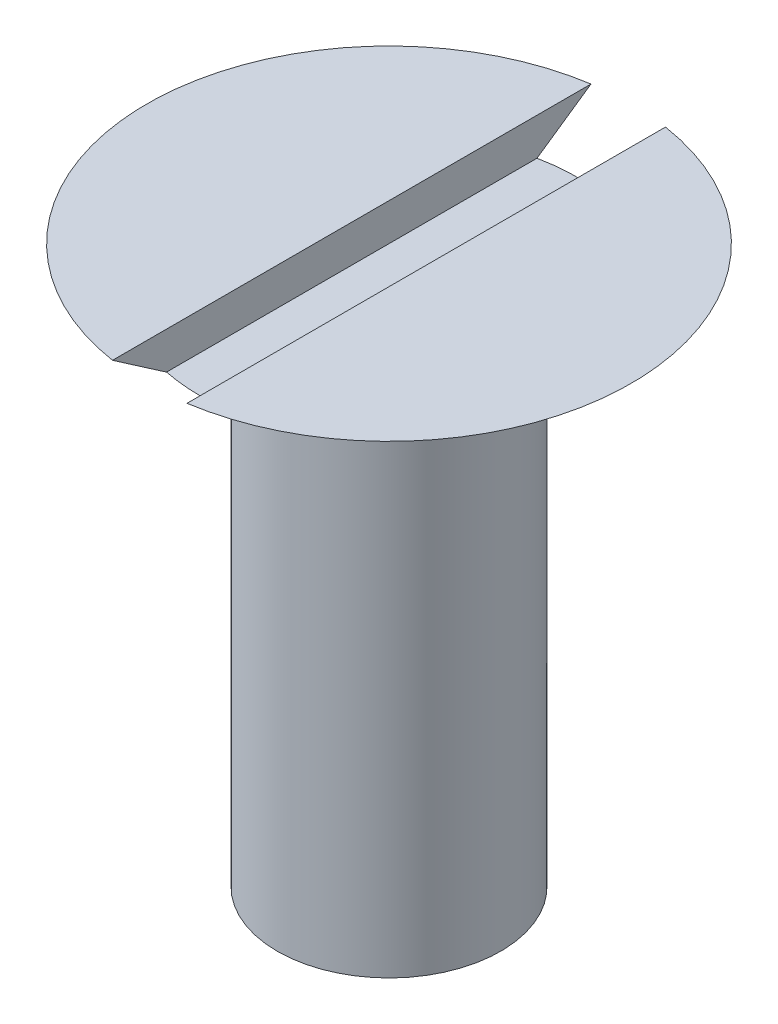
ISO-10303-21;
HEADER;
FILE_DESCRIPTION(('STEP AP214'),'2;1');
FILE_NAME('part.step','',(''),(''),'','','');
FILE_SCHEMA(('AUTOMOTIVE_DESIGN { 1 0 10303 214 1 1 1 1 }'));
ENDSEC;
DATA;
#1=APPLICATION_CONTEXT('core data for automotive mechanical design processes');
#2=APPLICATION_PROTOCOL_DEFINITION('international standard','automotive_design',2000,#1);
#3=PRODUCT_CONTEXT('',#1,'mechanical');
#4=PRODUCT('Part','Part','',(#3));
#5=PRODUCT_RELATED_PRODUCT_CATEGORY('part','',(#4));
#6=PRODUCT_DEFINITION_FORMATION('','',#4);
#7=PRODUCT_DEFINITION_CONTEXT('part definition',#1,'design');
#8=PRODUCT_DEFINITION('design','',#6,#7);
#9=PRODUCT_DEFINITION_SHAPE('','',#8);
#10=(LENGTH_UNIT() NAMED_UNIT(*) SI_UNIT(.MILLI.,.METRE.));
#11=(NAMED_UNIT(*) PLANE_ANGLE_UNIT() SI_UNIT($,.RADIAN.));
#12=(NAMED_UNIT(*) SI_UNIT($,.STERADIAN.) SOLID_ANGLE_UNIT());
#13=UNCERTAINTY_MEASURE_WITH_UNIT(LENGTH_MEASURE(1.E-05),#10,'distance_accuracy_value','');
#14=(GEOMETRIC_REPRESENTATION_CONTEXT(3) GLOBAL_UNCERTAINTY_ASSIGNED_CONTEXT((#13)) GLOBAL_UNIT_ASSIGNED_CONTEXT((#10,
#11,#12)) REPRESENTATION_CONTEXT('',''));
#15=CARTESIAN_POINT('',(0.,0.,0.));
#16=DIRECTION('',(0.,0.,1.));
#17=DIRECTION('',(1.,0.,0.));
#18=AXIS2_PLACEMENT_3D('',#15,#16,#17);
#19=CARTESIAN_POINT('',(0.,14.950726383734,0.));
#20=DIRECTION('',(0.,-1.,0.));
#21=DIRECTION('',(0.,0.,-1.));
#22=AXIS2_PLACEMENT_3D('',#19,#20,#21);
#23=PLANE('',#22);
#24=DIRECTION('',(0.,0.,1.));
#25=VECTOR('',#24,1.);
#26=CARTESIAN_POINT('',(1.00000000000003,14.950726383734,-6.50000000000001));
#27=LINE('',#26,#25);
#28=CARTESIAN_POINT('',(0.999999999999999,14.950726383734,-6.42261628933256));
#29=VERTEX_POINT('',#28);
#30=CARTESIAN_POINT('',(1.,14.950726383734,6.42261628933256));
#31=VERTEX_POINT('',#30);
#32=EDGE_CURVE('E138',#29,#31,#27,.T.);
#33=ORIENTED_EDGE('',*,*,#32,.T.);
#34=CARTESIAN_POINT('',(0.,14.950726383734,0.));
#35=DIRECTION('',(0.,1.,0.));
#36=DIRECTION('',(0.,0.,1.));
#37=AXIS2_PLACEMENT_3D('',#34,#35,#36);
#38=CIRCLE('',#37,6.5);
#39=EDGE_CURVE('E133',#31,#29,#38,.T.);
#40=ORIENTED_EDGE('',*,*,#39,.T.);
#41=EDGE_LOOP('',(#33,#40));
#42=FACE_BOUND('',#41,.T.);
#43=ADVANCED_FACE('F42',(#42),#23,.F.);
#44=CARTESIAN_POINT('',(0.,12.5,0.));
#45=DIRECTION('',(0.,1.,0.));
#46=DIRECTION('',(0.,0.,1.));
#47=AXIS2_PLACEMENT_3D('',#44,#45,#46);
#48=CONICAL_SURFACE('',#47,3.,0.95993108859688);
#49=CARTESIAN_POINT('',(0.,12.5,0.));
#50=DIRECTION('',(0.,1.,0.));
#51=DIRECTION('',(0.,0.,1.));
#52=AXIS2_PLACEMENT_3D('',#49,#50,#51);
#53=CIRCLE('',#52,3.);
#54=CARTESIAN_POINT('',(0.,12.5,3.));
#55=VERTEX_POINT('',#54);
#56=EDGE_CURVE('E127',#55,#55,#53,.T.);
#57=ORIENTED_EDGE('',*,*,#56,.T.);
#58=EDGE_LOOP('',(#57));
#59=FACE_BOUND('',#58,.T.);
#60=CARTESIAN_POINT('',(1.00000000000001,14.951426383734,-6.42362803610768));
#61=CARTESIAN_POINT('',(1.00000000000001,14.7965139900653,-6.19970336377959));
#62=CARTESIAN_POINT('',(1.00000000000001,14.6417117196829,-5.9757021324474));
#63=CARTESIAN_POINT('',(1.00000000000001,14.3324566281598,-5.52742720787741));
#64=CARTESIAN_POINT('',(1.00000000000001,14.1780038416323,-5.30315349076613));
#65=CARTESIAN_POINT('',(1.00000000000001,13.8717187304788,-4.85733140976845));
#66=CARTESIAN_POINT('',(1.00000000000002,13.719879492516,-4.63578779769756));
#67=CARTESIAN_POINT('',(1.00000000000001,13.4169561463886,-4.19221258476304));
#68=CARTESIAN_POINT('',(0.999999999999998,13.2658719732557,-3.97018102833574));
#69=CARTESIAN_POINT('',(1.,13.0256088981052,-3.61503960384481));
#70=CARTESIAN_POINT('',(1.00000000000001,12.9360440611501,-3.48219100247491));
#71=CARTESIAN_POINT('',(1.00000000000001,12.7574892327623,-3.21606590039512));
#72=CARTESIAN_POINT('',(1.00000000000001,12.6684993703745,-3.08278931303491));
#73=CARTESIAN_POINT('',(1.00000000000001,12.4904948171189,-2.81435971697741));
#74=CARTESIAN_POINT('',(1.00000000000001,12.4014884927007,-2.67920114640122));
#75=CARTESIAN_POINT('',(1.00000000000001,12.2248447325522,-2.40813276916209));
#76=CARTESIAN_POINT('',(1.,12.1372063404108,-2.27222358641676));
#77=CARTESIAN_POINT('',(1.,11.9632771262562,-1.99797492339448));
#78=CARTESIAN_POINT('',(1.00000000000001,11.877003143124,-1.85962466093085));
#79=CARTESIAN_POINT('',(1.00000000000001,11.7502486949999,-1.65020971976964));
#80=CARTESIAN_POINT('',(1.00000000000001,11.7083812402023,-1.57998669087204));
#81=CARTESIAN_POINT('',(1.00000000000001,11.6259520701719,-1.43878044178623));
#82=CARTESIAN_POINT('',(1.00000000000001,11.5853902747576,-1.36779726863722));
#83=CARTESIAN_POINT('',(1.00000000000001,11.5066359618916,-1.22574930082218));
#84=CARTESIAN_POINT('',(1.00000000000001,11.4684191766972,-1.15469804346936));
#85=CARTESIAN_POINT('',(1.00000000000001,11.3945862347029,-1.01118073316757));
#86=CARTESIAN_POINT('',(1.00000000000001,11.3589717957904,-0.93871378496773));
#87=CARTESIAN_POINT('',(1.00000000000001,11.2918829035429,-0.792300429653788));
#88=CARTESIAN_POINT('',(1.00000000000002,11.2603886650806,-0.718363217275427));
#89=CARTESIAN_POINT('',(1.00000000000001,11.2035156525853,-0.568207637076927));
#90=CARTESIAN_POINT('',(0.999999999999998,11.1781268702176,-0.491993235953346));
#91=CARTESIAN_POINT('',(1.,11.144977521099,-0.368333445342041));
#92=CARTESIAN_POINT('',(1.00000000000001,11.1342382474767,-0.321696091773746));
#93=CARTESIAN_POINT('',(1.00000000000001,11.1167992401518,-0.227654188564721));
#94=CARTESIAN_POINT('',(1.00000000000001,11.1100992450155,-0.180249688779877));
#95=CARTESIAN_POINT('',(1.00000000000001,11.1013662451796,-0.0853600362730016));
#96=CARTESIAN_POINT('',(1.00000000000001,11.099298569529,-0.0378781628267392));
#97=CARTESIAN_POINT('',(1.00000000000001,11.0999356784908,0.0570589969793447));
#98=CARTESIAN_POINT('',(1.00000000000001,11.1026410796064,0.104514279112602));
#99=CARTESIAN_POINT('',(1.00000000000001,11.1125233041378,0.198622801513355));
#100=CARTESIAN_POINT('',(1.00000000000001,11.1196701937526,0.245279279756146));
#101=CARTESIAN_POINT('',(1.00000000000001,11.1378059500239,0.337827899755186));
#102=CARTESIAN_POINT('',(1.00000000000001,11.1487953507261,0.383719934337044));
#103=CARTESIAN_POINT('',(1.00000000000001,11.1740192587125,0.475066336073127));
#104=CARTESIAN_POINT('',(1.00000000000001,11.1882841947041,0.520512146367663));
#105=CARTESIAN_POINT('',(1.00000000000001,11.2193099378505,0.610524912360574));
#106=CARTESIAN_POINT('',(1.00000000000001,11.2360704446865,0.655091973078515));
#107=CARTESIAN_POINT('',(1.00000000000001,11.2741746601509,0.75005730567476));
#108=CARTESIAN_POINT('',(1.00000000000001,11.2958288786199,0.800329913567384));
#109=CARTESIAN_POINT('',(1.00000000000001,11.3410437394786,0.900014990400857));
#110=CARTESIAN_POINT('',(1.00000000000001,11.3646048309023,0.949427253397873));
#111=CARTESIAN_POINT('',(1.00000000000001,11.437449726808,1.09669695720563));
#112=CARTESIAN_POINT('',(1.00000000000001,11.4888575470089,1.19349879835829));
#113=CARTESIAN_POINT('',(1.00000000000001,11.5951122151018,1.38550284234813));
#114=CARTESIAN_POINT('',(1.00000000000001,11.6499680813646,1.48069994798157));
#115=CARTESIAN_POINT('',(1.00000000000001,11.7617907597581,1.66985666742106));
#116=CARTESIAN_POINT('',(1.00000000000001,11.8187578132606,1.76381613805354));
#117=CARTESIAN_POINT('',(1.00000000000001,11.934301190611,1.95122236593946));
#118=CARTESIAN_POINT('',(1.00000000000001,11.9928827495414,2.04466587775217));
#119=CARTESIAN_POINT('',(1.00000000000001,12.1110315687426,2.23094242169524));
#120=CARTESIAN_POINT('',(1.00000000000001,12.1705989493502,2.3237753773348));
#121=CARTESIAN_POINT('',(1.00000000000001,12.3501144609208,2.6012554483497));
#122=CARTESIAN_POINT('',(1.,12.4710949689759,2.78523363550447));
#123=CARTESIAN_POINT('',(1.,12.689976184362,3.11506207670188));
#124=CARTESIAN_POINT('',(1.00000000000001,12.7875968913187,3.26109922412603));
#125=CARTESIAN_POINT('',(1.00000000000001,12.9835231715857,3.55271662820756));
#126=CARTESIAN_POINT('',(1.00000000000001,13.0818287549391,3.69829687811925));
#127=CARTESIAN_POINT('',(1.00000000000001,13.377591716564,4.13476065082375));
#128=CARTESIAN_POINT('',(1.00000000000001,13.5757587133282,4.42516277507503));
#129=CARTESIAN_POINT('',(1.00000000000001,13.9699105181373,5.00058090661142));
#130=CARTESIAN_POINT('',(1.00000000000001,14.1658789110031,5.28560818361849));
#131=CARTESIAN_POINT('',(1.00000000000001,14.5583220700331,5.85500225912971));
#132=CARTESIAN_POINT('',(1.00000000000001,14.7547963526673,6.1393693907557));
#133=CARTESIAN_POINT('',(1.,14.951426383734,6.42362803610774));
#134=B_SPLINE_CURVE_WITH_KNOTS('',3,(#60,#61,#62,#63,#64,#65,#66,#67,#68,#69,#70,#71,#72,#73,
#74,#75,#76,#77,#78,#79,#80,#81,#82,#83,#84,#85,#86,#87,#88,#89,#90,#91,#92,#93,#94,#95,#96,#97,
#98,#99,#100,#101,#102,#103,#104,#105,#106,#107,#108,#109,#110,#111,#112,#113,#114,#115,#116,
#117,#118,#119,#120,#121,#122,#123,#124,#125,#126,#127,#128,#129,#130,#131,#132,#133),
.UNSPECIFIED.,.F.,.F.,(4,2,2,2,2,2,2,2,2,2,2,2,2,2,2,2,2,2,2,2,2,2,2,2,2,2,2,2,2,2,2,2,2,2,2,2,
4),(0.,0.816860890652607,1.63379942297092,2.43954703921576,3.24522408965545,3.7258844607954,
4.20664920256384,4.69214307216297,5.177280746304,5.66637841059722,5.91163900247177,
6.15688450385516,6.39888127155619,6.64103637183978,6.88198226060266,7.12253044590371,
7.26596093299882,7.40938213586174,7.55172625387177,7.69408875876821,7.83550205146783,
7.97693500610371,8.11973916845119,8.26252615951118,8.4266854062523,8.5908834226307,
8.9195674492254,9.24915013229193,9.57877061348077,9.90962756687595,10.240525209457,
10.9010823668273,11.4280629227337,11.9550512227702,13.0097653760744,14.0474531197022,
15.0843710188812),.UNSPECIFIED.);
#135=CARTESIAN_POINT('',(1.,13.950726383734,-4.97229148798759));
#136=VERTEX_POINT('',#135);
#137=EDGE_CURVE('E11',#29,#136,#134,.T.);
#138=ORIENTED_EDGE('',*,*,#137,.F.);
#139=ORIENTED_EDGE('',*,*,#39,.F.);
#140=CARTESIAN_POINT('',(1.00000000000003,13.950726383734,4.97229148798763));
#141=VERTEX_POINT('',#140);
#142=EDGE_CURVE('E46',#141,#31,#134,.T.);
#143=ORIENTED_EDGE('',*,*,#142,.F.);
#144=CARTESIAN_POINT('',(0.,13.950726383734,0.));
#145=DIRECTION('',(0.,1.,0.));
#146=DIRECTION('',(0.,0.,1.));
#147=AXIS2_PLACEMENT_3D('',#144,#145,#146);
#148=CIRCLE('',#147,5.07185199325788);
#149=CARTESIAN_POINT('',(-0.999999999999984,13.950726383734,4.97229148798763));
#150=VERTEX_POINT('',#149);
#151=EDGE_CURVE('E102',#150,#141,#148,.T.);
#152=ORIENTED_EDGE('',*,*,#151,.F.);
#153=CARTESIAN_POINT('',(-0.999999999999973,14.951426383734,-6.42362803610769));
#154=CARTESIAN_POINT('',(-1.00000000000002,14.7965139900653,-6.1997033637796));
#155=CARTESIAN_POINT('',(-1.00000000000003,14.6417117196829,-5.9757021324474));
#156=CARTESIAN_POINT('',(-1.00000000000004,14.3324566281598,-5.52742720787742));
#157=CARTESIAN_POINT('',(-1.00000000000003,14.1780038416323,-5.30315349076614));
#158=CARTESIAN_POINT('',(-1.00000000000004,13.8717187304788,-4.85733140976846));
#159=CARTESIAN_POINT('',(-1.00000000000005,13.719879492516,-4.63578779769757));
#160=CARTESIAN_POINT('',(-1.00000000000002,13.4169561463886,-4.19221258476305));
#161=CARTESIAN_POINT('',(-0.999999999999987,13.2658719732557,-3.97018102833575));
#162=CARTESIAN_POINT('',(-1.,13.0256088981052,-3.61503960384482));
#163=CARTESIAN_POINT('',(-1.00000000000003,12.9360440611501,-3.48219100247492));
#164=CARTESIAN_POINT('',(-1.00000000000004,12.7574892327623,-3.21606590039513));
#165=CARTESIAN_POINT('',(-1.00000000000004,12.6684993703745,-3.08278931303493));
#166=CARTESIAN_POINT('',(-1.00000000000003,12.4904948171189,-2.81435971697743));
#167=CARTESIAN_POINT('',(-1.00000000000003,12.4014884927007,-2.67920114640123));
#168=CARTESIAN_POINT('',(-1.00000000000004,12.2248447325522,-2.40813276916212));
#169=CARTESIAN_POINT('',(-1.00000000000004,12.1372063404108,-2.27222358641681));
#170=CARTESIAN_POINT('',(-1.00000000000004,11.9632771262562,-1.99797492339452));
#171=CARTESIAN_POINT('',(-1.00000000000004,11.877003143124,-1.85962466093087));
#172=CARTESIAN_POINT('',(-1.00000000000003,11.7502486949999,-1.65020971976965));
#173=CARTESIAN_POINT('',(-1.00000000000003,11.7083812402023,-1.57998669087205));
#174=CARTESIAN_POINT('',(-1.00000000000003,11.6259520701719,-1.43878044178624));
#175=CARTESIAN_POINT('',(-1.00000000000003,11.5853902747576,-1.36779726863723));
#176=CARTESIAN_POINT('',(-1.00000000000003,11.5066359618916,-1.22574930082218));
#177=CARTESIAN_POINT('',(-1.00000000000004,11.4684191766972,-1.15469804346937));
#178=CARTESIAN_POINT('',(-1.00000000000003,11.3945862347029,-1.01118073316757));
#179=CARTESIAN_POINT('',(-1.00000000000003,11.3589717957904,-0.938713784967726));
#180=CARTESIAN_POINT('',(-1.00000000000004,11.2918829035429,-0.792300429653779));
#181=CARTESIAN_POINT('',(-1.00000000000005,11.2603886650806,-0.718363217275414));
#182=CARTESIAN_POINT('',(-1.00000000000002,11.2035156525853,-0.568207637076913));
#183=CARTESIAN_POINT('',(-0.999999999999991,11.1781268702176,-0.491993235953334));
#184=CARTESIAN_POINT('',(-1.00000000000001,11.144977521099,-0.368333445342026));
#185=CARTESIAN_POINT('',(-1.00000000000003,11.1342382474767,-0.321696091773728));
#186=CARTESIAN_POINT('',(-1.00000000000004,11.1167992401518,-0.2276541885647));
#187=CARTESIAN_POINT('',(-1.00000000000003,11.1100992450155,-0.180249688779855));
#188=CARTESIAN_POINT('',(-1.00000000000004,11.1013662451797,-0.0853600362729776));
#189=CARTESIAN_POINT('',(-1.00000000000005,11.0992985695291,-0.0378781628267143));
#190=CARTESIAN_POINT('',(-1.00000000000002,11.0999356784909,0.0570589969793718));
#191=CARTESIAN_POINT('',(-0.999999999999976,11.1026410796064,0.10451427911263));
#192=CARTESIAN_POINT('',(-0.999999999999977,11.1125233041378,0.198622801513378));
#193=CARTESIAN_POINT('',(-1.00000000000002,11.1196701937526,0.245279279756164));
#194=CARTESIAN_POINT('',(-1.00000000000005,11.1378059500239,0.337827899755196));
#195=CARTESIAN_POINT('',(-1.00000000000004,11.1487953507261,0.383719934337051));
#196=CARTESIAN_POINT('',(-1.00000000000003,11.1740192587125,0.475066336073128));
#197=CARTESIAN_POINT('',(-1.00000000000004,11.1882841947041,0.52051214636766));
#198=CARTESIAN_POINT('',(-1.00000000000003,11.2193099378506,0.610524912360565));
#199=CARTESIAN_POINT('',(-1.,11.2360704446865,0.655091973078505));
#200=CARTESIAN_POINT('',(-0.999999999999998,11.2741746601509,0.750057305674746));
#201=CARTESIAN_POINT('',(-1.00000000000002,11.2958288786199,0.800329913567368));
#202=CARTESIAN_POINT('',(-1.00000000000004,11.3410437394786,0.900014990400839));
#203=CARTESIAN_POINT('',(-1.00000000000004,11.3646048309023,0.949427253397857));
#204=CARTESIAN_POINT('',(-1.00000000000003,11.437449726808,1.09669695720562));
#205=CARTESIAN_POINT('',(-1.00000000000003,11.4888575470089,1.19349879835828));
#206=CARTESIAN_POINT('',(-1.00000000000004,11.5951122151018,1.38550284234812));
#207=CARTESIAN_POINT('',(-1.00000000000004,11.6499680813646,1.48069994798156));
#208=CARTESIAN_POINT('',(-1.00000000000003,11.7617907597581,1.66985666742106));
#209=CARTESIAN_POINT('',(-1.00000000000003,11.8187578132606,1.76381613805354));
#210=CARTESIAN_POINT('',(-1.00000000000003,11.934301190611,1.95122236593946));
#211=CARTESIAN_POINT('',(-1.00000000000003,11.9928827495414,2.04466587775218));
#212=CARTESIAN_POINT('',(-1.00000000000004,12.1110315687426,2.23094242169525));
#213=CARTESIAN_POINT('',(-1.00000000000004,12.1705989493502,2.32377537733481));
#214=CARTESIAN_POINT('',(-1.00000000000003,12.3501144609208,2.60125544834972));
#215=CARTESIAN_POINT('',(-1.00000000000001,12.4710949689759,2.7852336355045));
#216=CARTESIAN_POINT('',(-1.00000000000002,12.689976184362,3.1150620767019));
#217=CARTESIAN_POINT('',(-1.00000000000003,12.7875968913187,3.26109922412605));
#218=CARTESIAN_POINT('',(-1.00000000000004,12.9835231715857,3.55271662820756));
#219=CARTESIAN_POINT('',(-1.00000000000004,13.0818287549391,3.69829687811925));
#220=CARTESIAN_POINT('',(-1.00000000000003,13.377591716564,4.13476065082375));
#221=CARTESIAN_POINT('',(-1.00000000000003,13.5757587133282,4.42516277507502));
#222=CARTESIAN_POINT('',(-1.00000000000004,13.9699105181373,5.00058090661139));
#223=CARTESIAN_POINT('',(-1.00000000000004,14.165878911003,5.28560818361847));
#224=CARTESIAN_POINT('',(-1.00000000000003,14.5583220700331,5.85500225912967));
#225=CARTESIAN_POINT('',(-1.00000000000003,14.7547963526673,6.13936939075566));
#226=CARTESIAN_POINT('',(-1.00000000000001,14.951426383734,6.42362803610768));
#227=B_SPLINE_CURVE_WITH_KNOTS('',3,(#153,#154,#155,#156,#157,#158,#159,#160,#161,#162,#163,
#164,#165,#166,#167,#168,#169,#170,#171,#172,#173,#174,#175,#176,#177,#178,#179,#180,#181,#182,
#183,#184,#185,#186,#187,#188,#189,#190,#191,#192,#193,#194,#195,#196,#197,#198,#199,#200,#201,
#202,#203,#204,#205,#206,#207,#208,#209,#210,#211,#212,#213,#214,#215,#216,#217,#218,#219,#220,
#221,#222,#223,#224,#225,#226),.UNSPECIFIED.,.F.,.F.,(4,2,2,2,2,2,2,2,2,2,2,2,2,2,2,2,2,2,2,2,2,
2,2,2,2,2,2,2,2,2,2,2,2,2,2,2,4),(0.,0.816860890652607,1.63379942297092,2.43954703921576,
3.24522408965545,3.7258844607954,4.20664920256383,4.69214307216295,5.17728074630397,
5.66637841059721,5.91163900247176,6.15688450385516,6.39888127155619,6.64103637183979,
6.88198226060269,7.12253044590374,7.26596093299884,7.40938213586177,7.5517262538718,
7.69408875876825,7.83550205146785,7.97693500610372,8.11973916845118,8.26252615951117,
8.42668540625228,8.59088342263069,8.9195674492254,9.24915013229193,9.57877061348077,
9.90962756687597,10.240525209457,10.9010823668273,11.4280629227337,11.9550512227702,
13.0097653760744,14.0474531197021,15.0843710188812),.UNSPECIFIED.);
#228=CARTESIAN_POINT('',(-0.999999999999987,14.950726383734,6.42261628933263));
#229=VERTEX_POINT('',#228);
#230=EDGE_CURVE('E104',#150,#229,#227,.T.);
#231=ORIENTED_EDGE('',*,*,#230,.T.);
#232=CARTESIAN_POINT('',(-1.,14.950726383734,-6.42261628933256));
#233=VERTEX_POINT('',#232);
#234=EDGE_CURVE('E110',#233,#229,#38,.T.);
#235=ORIENTED_EDGE('',*,*,#234,.F.);
#236=CARTESIAN_POINT('',(-1.,13.950726383734,-4.97229148798758));
#237=VERTEX_POINT('',#236);
#238=EDGE_CURVE('E101',#233,#237,#227,.T.);
#239=ORIENTED_EDGE('',*,*,#238,.T.);
#240=EDGE_CURVE('E58',#136,#237,#148,.T.);
#241=ORIENTED_EDGE('',*,*,#240,.F.);
#242=EDGE_LOOP('',(#138,#139,#143,#152,#231,#235,#239,#241));
#243=FACE_BOUND('',#242,.T.);
#244=ADVANCED_FACE('F108',(#59,#243),#48,.T.);
#245=ORIENTED_EDGE('',*,*,#234,.T.);
#246=DIRECTION('',(0.,0.,1.));
#247=VECTOR('',#246,1.);
#248=CARTESIAN_POINT('',(-1.00000000000003,14.950726383734,-6.50000000000004));
#249=LINE('',#248,#247);
#250=EDGE_CURVE('E65',#233,#229,#249,.T.);
#251=ORIENTED_EDGE('',*,*,#250,.F.);
#252=EDGE_LOOP('',(#245,#251));
#253=FACE_BOUND('',#252,.T.);
#254=ADVANCED_FACE('F44',(#253),#23,.F.);
#255=CARTESIAN_POINT('',(0.,0.,0.));
#256=DIRECTION('',(0.,1.,0.));
#257=DIRECTION('',(0.,0.,1.));
#258=AXIS2_PLACEMENT_3D('',#255,#256,#257);
#259=CONICAL_SURFACE('',#258,3.,1.04719755119659);
#260=CARTESIAN_POINT('',(0.,-1.73205080756889,0.));
#261=VERTEX_POINT('',#260);
#262=VERTEX_LOOP('',#261);
#263=FACE_BOUND('',#262,.T.);
#264=CARTESIAN_POINT('',(0.,0.,0.));
#265=DIRECTION('',(0.,1.,0.));
#266=DIRECTION('',(0.,0.,1.));
#267=AXIS2_PLACEMENT_3D('',#264,#265,#266);
#268=CIRCLE('',#267,3.);
#269=CARTESIAN_POINT('',(0.,0.,3.));
#270=VERTEX_POINT('',#269);
#271=EDGE_CURVE('E122',#270,#270,#268,.T.);
#272=ORIENTED_EDGE('',*,*,#271,.F.);
#273=EDGE_LOOP('',(#272));
#274=FACE_BOUND('',#273,.T.);
#275=ADVANCED_FACE('F163',(#263,#274),#259,.T.);
#276=CARTESIAN_POINT('',(0.,14.950726383734,0.));
#277=DIRECTION('',(0.,1.,0.));
#278=DIRECTION('',(0.,0.,1.));
#279=AXIS2_PLACEMENT_3D('',#276,#277,#278);
#280=CYLINDRICAL_SURFACE('',#279,3.);
#281=ORIENTED_EDGE('',*,*,#56,.F.);
#282=EDGE_LOOP('',(#281));
#283=FACE_BOUND('',#282,.T.);
#284=ORIENTED_EDGE('',*,*,#271,.T.);
#285=EDGE_LOOP('',(#284));
#286=FACE_BOUND('',#285,.T.);
#287=ADVANCED_FACE('F157',(#283,#286),#280,.T.);
#288=CARTESIAN_POINT('',(1.00000000000001,0.,-6.49999999999997));
#289=DIRECTION('',(-1.,0.,0.));
#290=DIRECTION('',(0.,-1.,0.));
#291=AXIS2_PLACEMENT_3D('',#288,#289,#290);
#292=PLANE('',#291);
#293=ORIENTED_EDGE('',*,*,#137,.T.);
#294=DIRECTION('',(0.,0.,1.));
#295=VECTOR('',#294,1.);
#296=CARTESIAN_POINT('',(1.00000000000003,13.950726383734,-6.50000000000001));
#297=LINE('',#296,#295);
#298=EDGE_CURVE('E96',#136,#141,#297,.T.);
#299=ORIENTED_EDGE('',*,*,#298,.T.);
#300=ORIENTED_EDGE('',*,*,#142,.T.);
#301=ORIENTED_EDGE('',*,*,#32,.F.);
#302=EDGE_LOOP('',(#293,#299,#300,#301));
#303=FACE_BOUND('',#302,.T.);
#304=ADVANCED_FACE('F155',(#303),#292,.T.);
#305=CARTESIAN_POINT('',(0.,13.950726383734,-6.50000000000001));
#306=DIRECTION('',(0.,1.,0.));
#307=DIRECTION('',(0.,0.,1.));
#308=AXIS2_PLACEMENT_3D('',#305,#306,#307);
#309=PLANE('',#308);
#310=ORIENTED_EDGE('',*,*,#240,.T.);
#311=DIRECTION('',(0.,0.,1.));
#312=VECTOR('',#311,1.);
#313=CARTESIAN_POINT('',(-1.00000000000003,13.950726383734,-6.50000000000004));
#314=LINE('',#313,#312);
#315=EDGE_CURVE('E93',#237,#150,#314,.T.);
#316=ORIENTED_EDGE('',*,*,#315,.T.);
#317=ORIENTED_EDGE('',*,*,#151,.T.);
#318=ORIENTED_EDGE('',*,*,#298,.F.);
#319=EDGE_LOOP('',(#310,#316,#317,#318));
#320=FACE_BOUND('',#319,.T.);
#321=ADVANCED_FACE('F92',(#320),#309,.T.);
#322=CARTESIAN_POINT('',(-1.00000000000003,0.,-6.50000000000004));
#323=DIRECTION('',(-1.,0.,0.));
#324=DIRECTION('',(0.,-1.,0.));
#325=AXIS2_PLACEMENT_3D('',#322,#323,#324);
#326=PLANE('',#325);
#327=ORIENTED_EDGE('',*,*,#250,.T.);
#328=ORIENTED_EDGE('',*,*,#230,.F.);
#329=ORIENTED_EDGE('',*,*,#315,.F.);
#330=ORIENTED_EDGE('',*,*,#238,.F.);
#331=EDGE_LOOP('',(#327,#328,#329,#330));
#332=FACE_BOUND('',#331,.T.);
#333=ADVANCED_FACE('F103',(#332),#326,.F.);
#334=CLOSED_SHELL('',(#43,#244,#254,#275,#287,#304,#321,#333));
#335=MANIFOLD_SOLID_BREP('B2',#334);
#336=ADVANCED_BREP_SHAPE_REPRESENTATION('',(#18,#335),#14);
#337=SHAPE_DEFINITION_REPRESENTATION(#9,#336);
ENDSEC;
END-ISO-10303-21;
